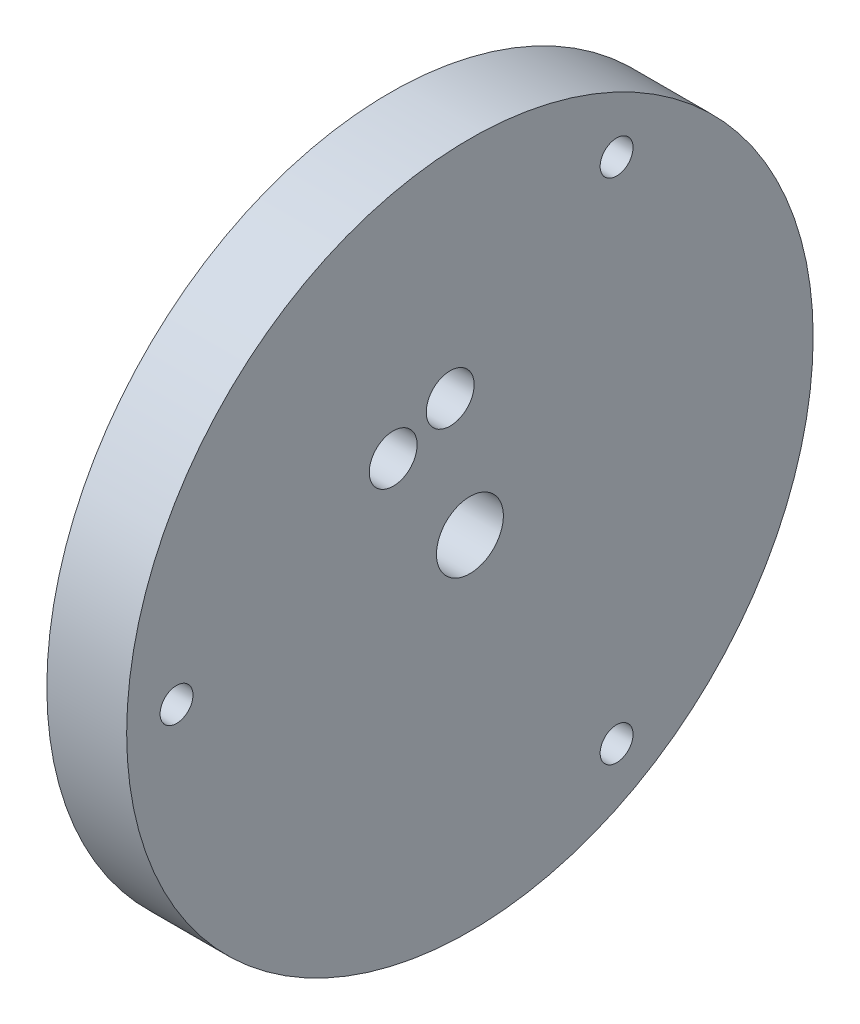
ISO-10303-21;
HEADER;
FILE_DESCRIPTION(('STEP AP214'),'2;1');
FILE_NAME('part.step','',(''),(''),'','','');
FILE_SCHEMA(('AUTOMOTIVE_DESIGN { 1 0 10303 214 1 1 1 1 }'));
ENDSEC;
DATA;
#1=APPLICATION_CONTEXT('core data for automotive mechanical design processes');
#2=APPLICATION_PROTOCOL_DEFINITION('international standard','automotive_design',2000,#1);
#3=PRODUCT_CONTEXT('',#1,'mechanical');
#4=PRODUCT('Part','Part','',(#3));
#5=PRODUCT_RELATED_PRODUCT_CATEGORY('part','',(#4));
#6=PRODUCT_DEFINITION_FORMATION('','',#4);
#7=PRODUCT_DEFINITION_CONTEXT('part definition',#1,'design');
#8=PRODUCT_DEFINITION('design','',#6,#7);
#9=PRODUCT_DEFINITION_SHAPE('','',#8);
#10=(LENGTH_UNIT() NAMED_UNIT(*) SI_UNIT(.MILLI.,.METRE.));
#11=(NAMED_UNIT(*) PLANE_ANGLE_UNIT() SI_UNIT($,.RADIAN.));
#12=(NAMED_UNIT(*) SI_UNIT($,.STERADIAN.) SOLID_ANGLE_UNIT());
#13=UNCERTAINTY_MEASURE_WITH_UNIT(LENGTH_MEASURE(1.E-05),#10,'distance_accuracy_value','');
#14=(GEOMETRIC_REPRESENTATION_CONTEXT(3) GLOBAL_UNCERTAINTY_ASSIGNED_CONTEXT((#13)) GLOBAL_UNIT_ASSIGNED_CONTEXT((#10,
#11,#12)) REPRESENTATION_CONTEXT('',''));
#15=CARTESIAN_POINT('',(0.,0.,0.));
#16=DIRECTION('',(0.,0.,1.));
#17=DIRECTION('',(1.,0.,0.));
#18=AXIS2_PLACEMENT_3D('',#15,#16,#17);
#19=CARTESIAN_POINT('',(148.7,34.4,0.));
#20=DIRECTION('',(1.,0.,0.));
#21=DIRECTION('',(0.,0.,-1.));
#22=AXIS2_PLACEMENT_3D('',#19,#20,#21);
#23=PLANE('',#22);
#24=CARTESIAN_POINT('',(148.7,0.,12.));
#25=DIRECTION('',(1.,0.,0.));
#26=DIRECTION('',(0.,0.,-1.));
#27=AXIS2_PLACEMENT_3D('',#24,#25,#26);
#28=CIRCLE('',#27,1.25);
#29=CARTESIAN_POINT('',(148.7,0.,10.75));
#30=VERTEX_POINT('',#29);
#31=EDGE_CURVE('E93',#30,#30,#28,.T.);
#32=ORIENTED_EDGE('',*,*,#31,.T.);
#33=EDGE_LOOP('',(#32));
#34=FACE_BOUND('',#33,.T.);
#35=CARTESIAN_POINT('',(148.7,-10.3923048454133,-6.));
#36=DIRECTION('',(1.,0.,0.));
#37=DIRECTION('',(0.,0.,-1.));
#38=AXIS2_PLACEMENT_3D('',#35,#36,#37);
#39=CIRCLE('',#38,1.25);
#40=CARTESIAN_POINT('',(148.7,-10.3923048454133,-7.25));
#41=VERTEX_POINT('',#40);
#42=EDGE_CURVE('E87',#41,#41,#39,.T.);
#43=ORIENTED_EDGE('',*,*,#42,.T.);
#44=EDGE_LOOP('',(#43));
#45=FACE_BOUND('',#44,.T.);
#46=CARTESIAN_POINT('',(148.7,10.3923048454133,-6.00000000000001));
#47=DIRECTION('',(1.,0.,0.));
#48=DIRECTION('',(0.,0.,-1.));
#49=AXIS2_PLACEMENT_3D('',#46,#47,#48);
#50=CIRCLE('',#49,1.25);
#51=CARTESIAN_POINT('',(148.7,10.3923048454133,-7.25000000000001));
#52=VERTEX_POINT('',#51);
#53=EDGE_CURVE('E81',#52,#52,#50,.T.);
#54=ORIENTED_EDGE('',*,*,#53,.T.);
#55=EDGE_LOOP('',(#54));
#56=FACE_BOUND('',#55,.T.);
#57=CARTESIAN_POINT('',(148.7,25.4611468712625,-14.7));
#58=DIRECTION('',(1.,0.,0.));
#59=DIRECTION('',(0.,0.,-1.));
#60=AXIS2_PLACEMENT_3D('',#57,#58,#59);
#61=CIRCLE('',#60,1.65);
#62=CARTESIAN_POINT('',(148.7,25.4611468712625,-16.35));
#63=VERTEX_POINT('',#62);
#64=EDGE_CURVE('E50',#63,#63,#61,.F.);
#65=ORIENTED_EDGE('',*,*,#64,.F.);
#66=EDGE_LOOP('',(#65));
#67=FACE_BOUND('',#66,.T.);
#68=CARTESIAN_POINT('',(148.7,-25.4611468712625,-14.7));
#69=DIRECTION('',(1.,0.,0.));
#70=DIRECTION('',(0.,0.,-1.));
#71=AXIS2_PLACEMENT_3D('',#68,#69,#70);
#72=CIRCLE('',#71,1.65);
#73=CARTESIAN_POINT('',(148.7,-25.4611468712625,-16.35));
#74=VERTEX_POINT('',#73);
#75=EDGE_CURVE('E53',#74,#74,#72,.F.);
#76=ORIENTED_EDGE('',*,*,#75,.F.);
#77=EDGE_LOOP('',(#76));
#78=FACE_BOUND('',#77,.T.);
#79=CARTESIAN_POINT('',(148.7,0.,29.4));
#80=DIRECTION('',(1.,0.,0.));
#81=DIRECTION('',(0.,0.,-1.));
#82=AXIS2_PLACEMENT_3D('',#79,#80,#81);
#83=CIRCLE('',#82,1.65);
#84=CARTESIAN_POINT('',(148.7,0.,27.75));
#85=VERTEX_POINT('',#84);
#86=EDGE_CURVE('E56',#85,#85,#83,.F.);
#87=ORIENTED_EDGE('',*,*,#86,.F.);
#88=EDGE_LOOP('',(#87));
#89=FACE_BOUND('',#88,.T.);
#90=CARTESIAN_POINT('',(148.7,10.4836474229945,7.68720604058077));
#91=DIRECTION('',(1.,0.,0.));
#92=DIRECTION('',(0.,0.,-1.));
#93=AXIS2_PLACEMENT_3D('',#90,#91,#92);
#94=CIRCLE('',#93,2.4);
#95=CARTESIAN_POINT('',(148.7,10.4836474229945,5.28720604058077));
#96=VERTEX_POINT('',#95);
#97=EDGE_CURVE('E59',#96,#96,#94,.F.);
#98=ORIENTED_EDGE('',*,*,#97,.F.);
#99=EDGE_LOOP('',(#98));
#100=FACE_BOUND('',#99,.T.);
#101=CARTESIAN_POINT('',(148.7,12.8487337040411,1.97738266469541));
#102=DIRECTION('',(1.,0.,0.));
#103=DIRECTION('',(0.,0.,-1.));
#104=AXIS2_PLACEMENT_3D('',#101,#102,#103);
#105=CIRCLE('',#104,2.4);
#106=CARTESIAN_POINT('',(148.7,12.8487337040411,-0.422617335304591));
#107=VERTEX_POINT('',#106);
#108=EDGE_CURVE('E62',#107,#107,#105,.F.);
#109=ORIENTED_EDGE('',*,*,#108,.F.);
#110=EDGE_LOOP('',(#109));
#111=FACE_BOUND('',#110,.T.);
#112=CARTESIAN_POINT('',(148.7,0.,0.));
#113=DIRECTION('',(-1.,0.,0.));
#114=DIRECTION('',(0.,0.,1.));
#115=AXIS2_PLACEMENT_3D('',#112,#113,#114);
#116=CIRCLE('',#115,3.35);
#117=CARTESIAN_POINT('',(148.7,0.,3.35));
#118=VERTEX_POINT('',#117);
#119=EDGE_CURVE('E10',#118,#118,#116,.T.);
#120=ORIENTED_EDGE('',*,*,#119,.F.);
#121=EDGE_LOOP('',(#120));
#122=FACE_BOUND('',#121,.T.);
#123=CARTESIAN_POINT('',(148.7,0.,0.));
#124=DIRECTION('',(-1.,0.,0.));
#125=DIRECTION('',(0.,0.,1.));
#126=AXIS2_PLACEMENT_3D('',#123,#124,#125);
#127=CIRCLE('',#126,34.4);
#128=CARTESIAN_POINT('',(148.7,0.,34.4));
#129=VERTEX_POINT('',#128);
#130=EDGE_CURVE('E45',#129,#129,#127,.T.);
#131=ORIENTED_EDGE('',*,*,#130,.T.);
#132=EDGE_LOOP('',(#131));
#133=FACE_BOUND('',#132,.T.);
#134=ADVANCED_FACE('F31',(#34,#45,#56,#67,#78,#89,#100,#111,#122,#133),#23,.F.);
#135=CARTESIAN_POINT('',(-110.,0.,0.));
#136=DIRECTION('',(-1.,0.,0.));
#137=DIRECTION('',(0.,0.,1.));
#138=AXIS2_PLACEMENT_3D('',#135,#136,#137);
#139=CYLINDRICAL_SURFACE('',#138,3.35);
#140=CARTESIAN_POINT('',(156.7,0.,0.));
#141=DIRECTION('',(-1.,0.,0.));
#142=DIRECTION('',(0.,0.,1.));
#143=AXIS2_PLACEMENT_3D('',#140,#141,#142);
#144=CIRCLE('',#143,3.35);
#145=CARTESIAN_POINT('',(156.7,0.,3.35));
#146=VERTEX_POINT('',#145);
#147=EDGE_CURVE('E37',#146,#146,#144,.T.);
#148=ORIENTED_EDGE('',*,*,#147,.F.);
#149=EDGE_LOOP('',(#148));
#150=FACE_BOUND('',#149,.T.);
#151=ORIENTED_EDGE('',*,*,#119,.T.);
#152=EDGE_LOOP('',(#151));
#153=FACE_BOUND('',#152,.T.);
#154=ADVANCED_FACE('F111',(#150,#153),#139,.F.);
#155=CARTESIAN_POINT('',(156.7,3.35,0.));
#156=DIRECTION('',(-1.,0.,0.));
#157=DIRECTION('',(0.,0.,1.));
#158=AXIS2_PLACEMENT_3D('',#155,#156,#157);
#159=PLANE('',#158);
#160=CARTESIAN_POINT('',(156.7,25.4611468712625,-14.7));
#161=DIRECTION('',(1.,0.,0.));
#162=DIRECTION('',(0.,0.,-1.));
#163=AXIS2_PLACEMENT_3D('',#160,#161,#162);
#164=CIRCLE('',#163,1.65);
#165=CARTESIAN_POINT('',(156.7,25.4611468712625,-16.35));
#166=VERTEX_POINT('',#165);
#167=EDGE_CURVE('E69',#166,#166,#164,.T.);
#168=ORIENTED_EDGE('',*,*,#167,.F.);
#169=EDGE_LOOP('',(#168));
#170=FACE_BOUND('',#169,.T.);
#171=CARTESIAN_POINT('',(156.7,-25.4611468712625,-14.7));
#172=DIRECTION('',(1.,0.,0.));
#173=DIRECTION('',(0.,0.,-1.));
#174=AXIS2_PLACEMENT_3D('',#171,#172,#173);
#175=CIRCLE('',#174,1.65);
#176=CARTESIAN_POINT('',(156.7,-25.4611468712625,-16.35));
#177=VERTEX_POINT('',#176);
#178=EDGE_CURVE('E72',#177,#177,#175,.T.);
#179=ORIENTED_EDGE('',*,*,#178,.F.);
#180=EDGE_LOOP('',(#179));
#181=FACE_BOUND('',#180,.T.);
#182=CARTESIAN_POINT('',(156.7,0.,29.4));
#183=DIRECTION('',(1.,0.,0.));
#184=DIRECTION('',(0.,0.,-1.));
#185=AXIS2_PLACEMENT_3D('',#182,#183,#184);
#186=CIRCLE('',#185,1.65);
#187=CARTESIAN_POINT('',(156.7,0.,27.75));
#188=VERTEX_POINT('',#187);
#189=EDGE_CURVE('E76',#188,#188,#186,.T.);
#190=ORIENTED_EDGE('',*,*,#189,.F.);
#191=EDGE_LOOP('',(#190));
#192=FACE_BOUND('',#191,.T.);
#193=CARTESIAN_POINT('',(156.7,10.4836474229945,7.68720604058077));
#194=DIRECTION('',(1.,0.,0.));
#195=DIRECTION('',(0.,0.,-1.));
#196=AXIS2_PLACEMENT_3D('',#193,#194,#195);
#197=CIRCLE('',#196,2.4);
#198=CARTESIAN_POINT('',(156.7,10.4836474229945,5.28720604058077));
#199=VERTEX_POINT('',#198);
#200=EDGE_CURVE('E68',#199,#199,#197,.T.);
#201=ORIENTED_EDGE('',*,*,#200,.F.);
#202=EDGE_LOOP('',(#201));
#203=FACE_BOUND('',#202,.T.);
#204=CARTESIAN_POINT('',(156.7,12.8487337040411,1.97738266469541));
#205=DIRECTION('',(1.,0.,0.));
#206=DIRECTION('',(0.,0.,-1.));
#207=AXIS2_PLACEMENT_3D('',#204,#205,#206);
#208=CIRCLE('',#207,2.4);
#209=CARTESIAN_POINT('',(156.7,12.8487337040411,-0.422617335304591));
#210=VERTEX_POINT('',#209);
#211=EDGE_CURVE('E65',#210,#210,#208,.T.);
#212=ORIENTED_EDGE('',*,*,#211,.F.);
#213=EDGE_LOOP('',(#212));
#214=FACE_BOUND('',#213,.T.);
#215=CARTESIAN_POINT('',(156.7,0.,0.));
#216=DIRECTION('',(-1.,0.,0.));
#217=DIRECTION('',(0.,0.,1.));
#218=AXIS2_PLACEMENT_3D('',#215,#216,#217);
#219=CIRCLE('',#218,34.4);
#220=CARTESIAN_POINT('',(156.7,0.,34.4));
#221=VERTEX_POINT('',#220);
#222=EDGE_CURVE('E41',#221,#221,#219,.T.);
#223=ORIENTED_EDGE('',*,*,#222,.F.);
#224=EDGE_LOOP('',(#223));
#225=FACE_BOUND('',#224,.T.);
#226=ORIENTED_EDGE('',*,*,#147,.T.);
#227=EDGE_LOOP('',(#226));
#228=FACE_BOUND('',#227,.T.);
#229=ADVANCED_FACE('F116',(#170,#181,#192,#203,#214,#225,#228),#159,.F.);
#230=CARTESIAN_POINT('',(-110.,0.,0.));
#231=DIRECTION('',(-1.,0.,0.));
#232=DIRECTION('',(0.,0.,1.));
#233=AXIS2_PLACEMENT_3D('',#230,#231,#232);
#234=CYLINDRICAL_SURFACE('',#233,34.4);
#235=ORIENTED_EDGE('',*,*,#130,.F.);
#236=EDGE_LOOP('',(#235));
#237=FACE_BOUND('',#236,.T.);
#238=ORIENTED_EDGE('',*,*,#222,.T.);
#239=EDGE_LOOP('',(#238));
#240=FACE_BOUND('',#239,.T.);
#241=ADVANCED_FACE('F137',(#237,#240),#234,.T.);
#242=CARTESIAN_POINT('',(156.7,12.8487337040411,1.97738266469541));
#243=DIRECTION('',(-1.,0.,0.));
#244=DIRECTION('',(0.,0.,1.));
#245=AXIS2_PLACEMENT_3D('',#242,#243,#244);
#246=CYLINDRICAL_SURFACE('',#245,2.4);
#247=ORIENTED_EDGE('',*,*,#211,.T.);
#248=EDGE_LOOP('',(#247));
#249=FACE_BOUND('',#248,.T.);
#250=ORIENTED_EDGE('',*,*,#108,.T.);
#251=EDGE_LOOP('',(#250));
#252=FACE_BOUND('',#251,.T.);
#253=ADVANCED_FACE('F140',(#249,#252),#246,.F.);
#254=CARTESIAN_POINT('',(156.7,10.4836474229945,7.68720604058077));
#255=DIRECTION('',(-1.,0.,0.));
#256=DIRECTION('',(0.,0.,1.));
#257=AXIS2_PLACEMENT_3D('',#254,#255,#256);
#258=CYLINDRICAL_SURFACE('',#257,2.4);
#259=ORIENTED_EDGE('',*,*,#200,.T.);
#260=EDGE_LOOP('',(#259));
#261=FACE_BOUND('',#260,.T.);
#262=ORIENTED_EDGE('',*,*,#97,.T.);
#263=EDGE_LOOP('',(#262));
#264=FACE_BOUND('',#263,.T.);
#265=ADVANCED_FACE('F154',(#261,#264),#258,.F.);
#266=CARTESIAN_POINT('',(156.7,0.,29.4));
#267=DIRECTION('',(-1.,0.,0.));
#268=DIRECTION('',(0.,0.,1.));
#269=AXIS2_PLACEMENT_3D('',#266,#267,#268);
#270=CYLINDRICAL_SURFACE('',#269,1.65);
#271=ORIENTED_EDGE('',*,*,#189,.T.);
#272=EDGE_LOOP('',(#271));
#273=FACE_BOUND('',#272,.T.);
#274=ORIENTED_EDGE('',*,*,#86,.T.);
#275=EDGE_LOOP('',(#274));
#276=FACE_BOUND('',#275,.T.);
#277=ADVANCED_FACE('F164',(#273,#276),#270,.F.);
#278=CARTESIAN_POINT('',(156.7,-25.4611468712625,-14.7));
#279=DIRECTION('',(-1.,0.,0.));
#280=DIRECTION('',(0.,0.,1.));
#281=AXIS2_PLACEMENT_3D('',#278,#279,#280);
#282=CYLINDRICAL_SURFACE('',#281,1.65);
#283=ORIENTED_EDGE('',*,*,#178,.T.);
#284=EDGE_LOOP('',(#283));
#285=FACE_BOUND('',#284,.T.);
#286=ORIENTED_EDGE('',*,*,#75,.T.);
#287=EDGE_LOOP('',(#286));
#288=FACE_BOUND('',#287,.T.);
#289=ADVANCED_FACE('F160',(#285,#288),#282,.F.);
#290=CARTESIAN_POINT('',(156.7,25.4611468712625,-14.7));
#291=DIRECTION('',(-1.,0.,0.));
#292=DIRECTION('',(0.,0.,1.));
#293=AXIS2_PLACEMENT_3D('',#290,#291,#292);
#294=CYLINDRICAL_SURFACE('',#293,1.65);
#295=ORIENTED_EDGE('',*,*,#167,.T.);
#296=EDGE_LOOP('',(#295));
#297=FACE_BOUND('',#296,.T.);
#298=ORIENTED_EDGE('',*,*,#64,.T.);
#299=EDGE_LOOP('',(#298));
#300=FACE_BOUND('',#299,.T.);
#301=ADVANCED_FACE('F156',(#297,#300),#294,.F.);
#302=CARTESIAN_POINT('',(154.7,10.3923048454133,-6.00000000000001));
#303=DIRECTION('',(-1.,0.,0.));
#304=DIRECTION('',(0.,0.,1.));
#305=AXIS2_PLACEMENT_3D('',#302,#303,#304);
#306=CYLINDRICAL_SURFACE('',#305,1.25);
#307=CARTESIAN_POINT('',(154.7,10.3923048454133,-6.00000000000001));
#308=DIRECTION('',(1.,0.,0.));
#309=DIRECTION('',(0.,0.,-1.));
#310=AXIS2_PLACEMENT_3D('',#307,#308,#309);
#311=CIRCLE('',#310,1.25);
#312=CARTESIAN_POINT('',(154.7,10.3923048454133,-7.25000000000001));
#313=VERTEX_POINT('',#312);
#314=EDGE_CURVE('E84',#313,#313,#311,.T.);
#315=ORIENTED_EDGE('',*,*,#314,.T.);
#316=EDGE_LOOP('',(#315));
#317=FACE_BOUND('',#316,.T.);
#318=ORIENTED_EDGE('',*,*,#53,.F.);
#319=EDGE_LOOP('',(#318));
#320=FACE_BOUND('',#319,.T.);
#321=ADVANCED_FACE('F159',(#317,#320),#306,.F.);
#322=CARTESIAN_POINT('',(154.7,10.3923048454133,-6.00000000000001));
#323=DIRECTION('',(1.,0.,0.));
#324=DIRECTION('',(0.,0.,-1.));
#325=AXIS2_PLACEMENT_3D('',#322,#323,#324);
#326=PLANE('',#325);
#327=ORIENTED_EDGE('',*,*,#314,.F.);
#328=EDGE_LOOP('',(#327));
#329=FACE_BOUND('',#328,.T.);
#330=ADVANCED_FACE('F174',(#329),#326,.F.);
#331=CARTESIAN_POINT('',(154.7,-10.3923048454133,-6.));
#332=DIRECTION('',(-1.,0.,0.));
#333=DIRECTION('',(0.,0.,1.));
#334=AXIS2_PLACEMENT_3D('',#331,#332,#333);
#335=CYLINDRICAL_SURFACE('',#334,1.25);
#336=CARTESIAN_POINT('',(154.7,-10.3923048454133,-6.));
#337=DIRECTION('',(1.,0.,0.));
#338=DIRECTION('',(0.,0.,-1.));
#339=AXIS2_PLACEMENT_3D('',#336,#337,#338);
#340=CIRCLE('',#339,1.25);
#341=CARTESIAN_POINT('',(154.7,-10.3923048454133,-7.25));
#342=VERTEX_POINT('',#341);
#343=EDGE_CURVE('E90',#342,#342,#340,.T.);
#344=ORIENTED_EDGE('',*,*,#343,.T.);
#345=EDGE_LOOP('',(#344));
#346=FACE_BOUND('',#345,.T.);
#347=ORIENTED_EDGE('',*,*,#42,.F.);
#348=EDGE_LOOP('',(#347));
#349=FACE_BOUND('',#348,.T.);
#350=ADVANCED_FACE('F178',(#346,#349),#335,.F.);
#351=CARTESIAN_POINT('',(154.7,-10.3923048454133,-6.));
#352=DIRECTION('',(1.,0.,0.));
#353=DIRECTION('',(0.,0.,-1.));
#354=AXIS2_PLACEMENT_3D('',#351,#352,#353);
#355=PLANE('',#354);
#356=ORIENTED_EDGE('',*,*,#343,.F.);
#357=EDGE_LOOP('',(#356));
#358=FACE_BOUND('',#357,.T.);
#359=ADVANCED_FACE('F108',(#358),#355,.F.);
#360=CARTESIAN_POINT('',(154.7,0.,12.));
#361=DIRECTION('',(-1.,0.,0.));
#362=DIRECTION('',(0.,0.,1.));
#363=AXIS2_PLACEMENT_3D('',#360,#361,#362);
#364=CYLINDRICAL_SURFACE('',#363,1.25);
#365=CARTESIAN_POINT('',(154.7,0.,12.));
#366=DIRECTION('',(1.,0.,0.));
#367=DIRECTION('',(0.,0.,-1.));
#368=AXIS2_PLACEMENT_3D('',#365,#366,#367);
#369=CIRCLE('',#368,1.25);
#370=CARTESIAN_POINT('',(154.7,0.,10.75));
#371=VERTEX_POINT('',#370);
#372=EDGE_CURVE('E73',#371,#371,#369,.T.);
#373=ORIENTED_EDGE('',*,*,#372,.T.);
#374=EDGE_LOOP('',(#373));
#375=FACE_BOUND('',#374,.T.);
#376=ORIENTED_EDGE('',*,*,#31,.F.);
#377=EDGE_LOOP('',(#376));
#378=FACE_BOUND('',#377,.T.);
#379=ADVANCED_FACE('F99',(#375,#378),#364,.F.);
#380=CARTESIAN_POINT('',(154.7,0.,12.));
#381=DIRECTION('',(1.,0.,0.));
#382=DIRECTION('',(0.,0.,-1.));
#383=AXIS2_PLACEMENT_3D('',#380,#381,#382);
#384=PLANE('',#383);
#385=ORIENTED_EDGE('',*,*,#372,.F.);
#386=EDGE_LOOP('',(#385));
#387=FACE_BOUND('',#386,.T.);
#388=ADVANCED_FACE('F102',(#387),#384,.F.);
#389=CLOSED_SHELL('',(#134,#154,#229,#241,#253,#265,#277,#289,#301,#321,#330,#350,#359,#379,#388));
#390=MANIFOLD_SOLID_BREP('B2',#389);
#391=ADVANCED_BREP_SHAPE_REPRESENTATION('',(#18,#390),#14);
#392=SHAPE_DEFINITION_REPRESENTATION(#9,#391);
ENDSEC;
END-ISO-10303-21;
